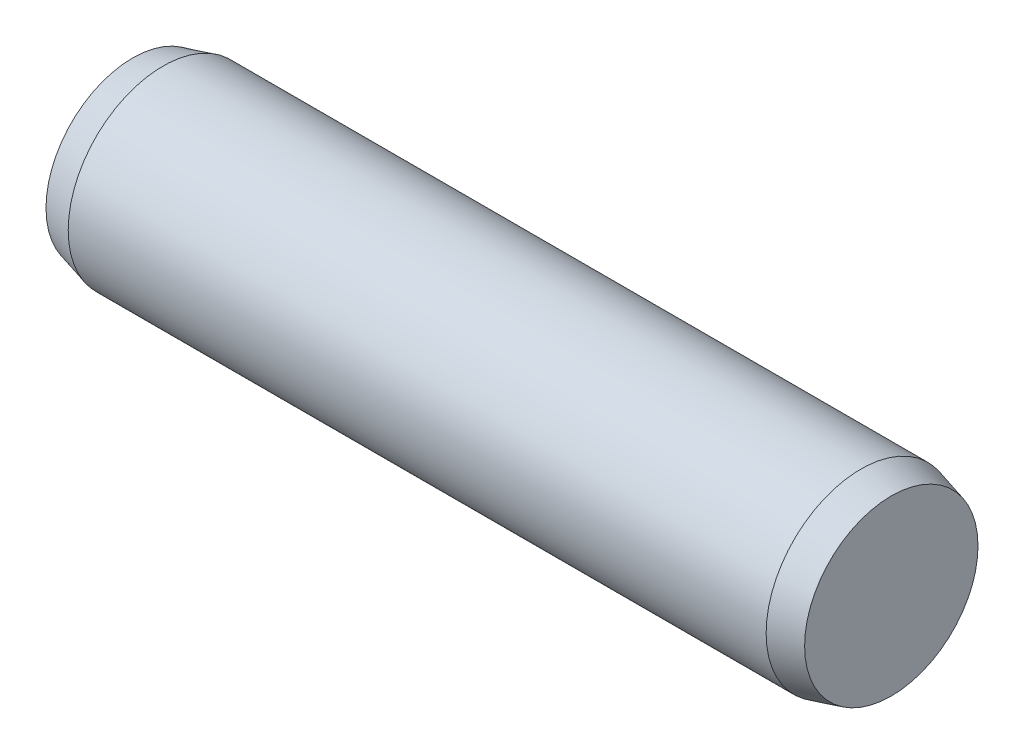
ISO-10303-21;
HEADER;
FILE_DESCRIPTION(('STEP AP214'),'2;1');
FILE_NAME('part.step','',(''),(''),'','','');
FILE_SCHEMA(('AUTOMOTIVE_DESIGN { 1 0 10303 214 1 1 1 1 }'));
ENDSEC;
DATA;
#1=APPLICATION_CONTEXT('core data for automotive mechanical design processes');
#2=APPLICATION_PROTOCOL_DEFINITION('international standard','automotive_design',2000,#1);
#3=PRODUCT_CONTEXT('',#1,'mechanical');
#4=PRODUCT('Part','Part','',(#3));
#5=PRODUCT_RELATED_PRODUCT_CATEGORY('part','',(#4));
#6=PRODUCT_DEFINITION_FORMATION('','',#4);
#7=PRODUCT_DEFINITION_CONTEXT('part definition',#1,'design');
#8=PRODUCT_DEFINITION('design','',#6,#7);
#9=PRODUCT_DEFINITION_SHAPE('','',#8);
#10=(LENGTH_UNIT() NAMED_UNIT(*) SI_UNIT(.MILLI.,.METRE.));
#11=(NAMED_UNIT(*) PLANE_ANGLE_UNIT() SI_UNIT($,.RADIAN.));
#12=(NAMED_UNIT(*) SI_UNIT($,.STERADIAN.) SOLID_ANGLE_UNIT());
#13=UNCERTAINTY_MEASURE_WITH_UNIT(LENGTH_MEASURE(1.E-05),#10,'distance_accuracy_value','');
#14=(GEOMETRIC_REPRESENTATION_CONTEXT(3) GLOBAL_UNCERTAINTY_ASSIGNED_CONTEXT((#13)) GLOBAL_UNIT_ASSIGNED_CONTEXT((#10,
#11,#12)) REPRESENTATION_CONTEXT('',''));
#15=CARTESIAN_POINT('',(0.,0.,0.));
#16=DIRECTION('',(0.,0.,1.));
#17=DIRECTION('',(1.,0.,0.));
#18=AXIS2_PLACEMENT_3D('',#15,#16,#17);
#19=CARTESIAN_POINT('',(0.,11.4282032302755,0.));
#20=DIRECTION('',(1.,0.,0.));
#21=DIRECTION('',(0.,0.,-1.));
#22=AXIS2_PLACEMENT_3D('',#19,#20,#21);
#23=PLANE('',#22);
#24=CARTESIAN_POINT('',(0.,0.,0.));
#25=DIRECTION('',(-1.,0.,0.));
#26=DIRECTION('',(0.,0.,1.));
#27=AXIS2_PLACEMENT_3D('',#24,#25,#26);
#28=CIRCLE('',#27,11.4282032302755);
#29=CARTESIAN_POINT('',(0.,0.,11.4282032302755));
#30=VERTEX_POINT('',#29);
#31=EDGE_CURVE('E44',#30,#30,#28,.T.);
#32=ORIENTED_EDGE('',*,*,#31,.T.);
#33=EDGE_LOOP('',(#32));
#34=FACE_BOUND('',#33,.T.);
#35=ADVANCED_FACE('F30',(#34),#23,.F.);
#36=CARTESIAN_POINT('',(100.,0.,0.));
#37=DIRECTION('',(-1.,0.,0.));
#38=DIRECTION('',(0.,0.,1.));
#39=AXIS2_PLACEMENT_3D('',#36,#37,#38);
#40=PLANE('',#39);
#41=CARTESIAN_POINT('',(100.,0.,0.));
#42=DIRECTION('',(-1.,0.,0.));
#43=DIRECTION('',(0.,0.,1.));
#44=AXIS2_PLACEMENT_3D('',#41,#42,#43);
#45=CIRCLE('',#44,11.4282032302755);
#46=CARTESIAN_POINT('',(100.,0.,11.4282032302755));
#47=VERTEX_POINT('',#46);
#48=EDGE_CURVE('E10',#47,#47,#45,.T.);
#49=ORIENTED_EDGE('',*,*,#48,.F.);
#50=EDGE_LOOP('',(#49));
#51=FACE_BOUND('',#50,.T.);
#52=ADVANCED_FACE('F64',(#51),#40,.F.);
#53=CARTESIAN_POINT('',(100.,0.,0.));
#54=DIRECTION('',(-1.,0.,0.));
#55=DIRECTION('',(0.,0.,1.));
#56=AXIS2_PLACEMENT_3D('',#53,#54,#55);
#57=CONICAL_SURFACE('',#56,11.4282032302755,0.26179938779915);
#58=CARTESIAN_POINT('',(96.,0.,0.));
#59=DIRECTION('',(-1.,0.,0.));
#60=DIRECTION('',(0.,0.,1.));
#61=AXIS2_PLACEMENT_3D('',#58,#59,#60);
#62=CIRCLE('',#61,12.5);
#63=CARTESIAN_POINT('',(96.,0.,12.5));
#64=VERTEX_POINT('',#63);
#65=EDGE_CURVE('E36',#64,#64,#62,.T.);
#66=ORIENTED_EDGE('',*,*,#65,.F.);
#67=EDGE_LOOP('',(#66));
#68=FACE_BOUND('',#67,.T.);
#69=ORIENTED_EDGE('',*,*,#48,.T.);
#70=EDGE_LOOP('',(#69));
#71=FACE_BOUND('',#70,.T.);
#72=ADVANCED_FACE('F59',(#68,#71),#57,.T.);
#73=CARTESIAN_POINT('',(-6.35,0.,0.));
#74=DIRECTION('',(-1.,0.,0.));
#75=DIRECTION('',(0.,0.,1.));
#76=AXIS2_PLACEMENT_3D('',#73,#74,#75);
#77=CYLINDRICAL_SURFACE('',#76,12.5);
#78=CARTESIAN_POINT('',(4.,0.,0.));
#79=DIRECTION('',(-1.,0.,0.));
#80=DIRECTION('',(0.,0.,1.));
#81=AXIS2_PLACEMENT_3D('',#78,#79,#80);
#82=CIRCLE('',#81,12.5);
#83=CARTESIAN_POINT('',(4.,0.,12.5));
#84=VERTEX_POINT('',#83);
#85=EDGE_CURVE('E40',#84,#84,#82,.T.);
#86=ORIENTED_EDGE('',*,*,#85,.F.);
#87=EDGE_LOOP('',(#86));
#88=FACE_BOUND('',#87,.T.);
#89=ORIENTED_EDGE('',*,*,#65,.T.);
#90=EDGE_LOOP('',(#89));
#91=FACE_BOUND('',#90,.T.);
#92=ADVANCED_FACE('F54',(#88,#91),#77,.T.);
#93=CARTESIAN_POINT('',(4.,0.,0.));
#94=DIRECTION('',(1.,0.,0.));
#95=DIRECTION('',(0.,0.,-1.));
#96=AXIS2_PLACEMENT_3D('',#93,#94,#95);
#97=CONICAL_SURFACE('',#96,12.5,0.261799387799143);
#98=ORIENTED_EDGE('',*,*,#31,.F.);
#99=EDGE_LOOP('',(#98));
#100=FACE_BOUND('',#99,.T.);
#101=ORIENTED_EDGE('',*,*,#85,.T.);
#102=EDGE_LOOP('',(#101));
#103=FACE_BOUND('',#102,.T.);
#104=ADVANCED_FACE('F51',(#100,#103),#97,.T.);
#105=CLOSED_SHELL('',(#35,#52,#72,#92,#104));
#106=MANIFOLD_SOLID_BREP('B2',#105);
#107=ADVANCED_BREP_SHAPE_REPRESENTATION('',(#18,#106),#14);
#108=SHAPE_DEFINITION_REPRESENTATION(#9,#107);
ENDSEC;
END-ISO-10303-21;
